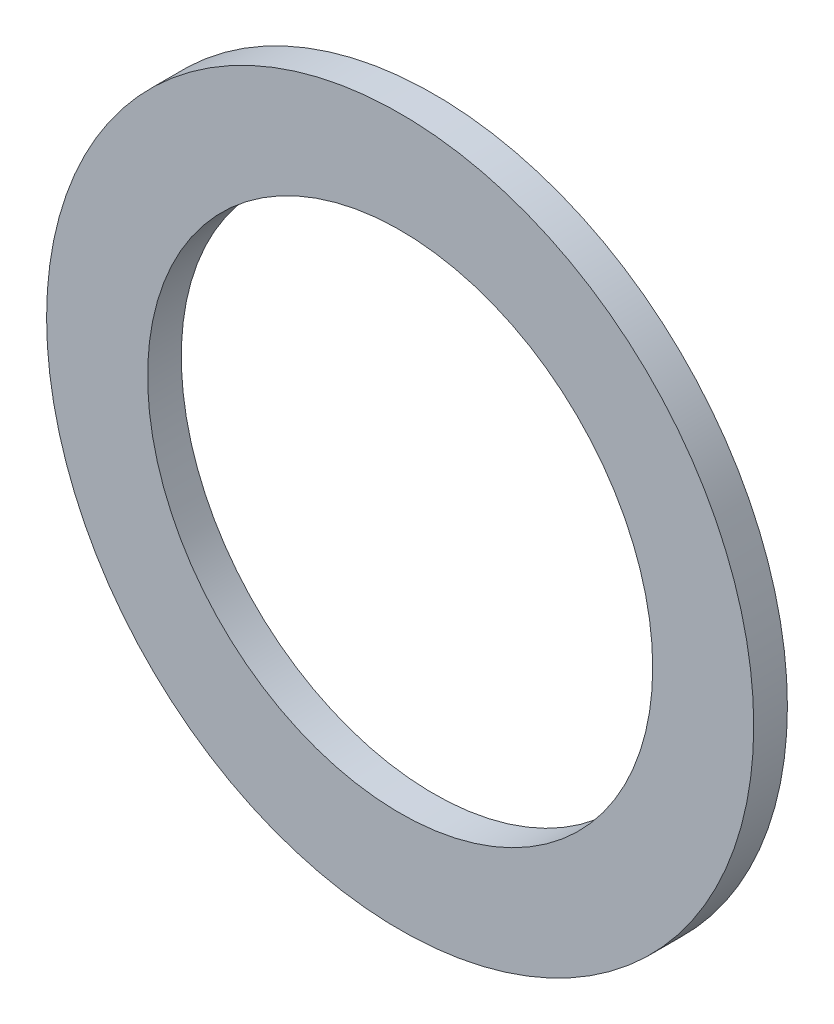
ISO-10303-21;
HEADER;
FILE_DESCRIPTION(('STEP AP214'),'2;1');
FILE_NAME('part.step','',(''),(''),'','','');
FILE_SCHEMA(('AUTOMOTIVE_DESIGN { 1 0 10303 214 1 1 1 1 }'));
ENDSEC;
DATA;
#1=APPLICATION_CONTEXT('core data for automotive mechanical design processes');
#2=APPLICATION_PROTOCOL_DEFINITION('international standard','automotive_design',2000,#1);
#3=PRODUCT_CONTEXT('',#1,'mechanical');
#4=PRODUCT('Part','Part','',(#3));
#5=PRODUCT_RELATED_PRODUCT_CATEGORY('part','',(#4));
#6=PRODUCT_DEFINITION_FORMATION('','',#4);
#7=PRODUCT_DEFINITION_CONTEXT('part definition',#1,'design');
#8=PRODUCT_DEFINITION('design','',#6,#7);
#9=PRODUCT_DEFINITION_SHAPE('','',#8);
#10=(LENGTH_UNIT() NAMED_UNIT(*) SI_UNIT(.MILLI.,.METRE.));
#11=(NAMED_UNIT(*) PLANE_ANGLE_UNIT() SI_UNIT($,.RADIAN.));
#12=(NAMED_UNIT(*) SI_UNIT($,.STERADIAN.) SOLID_ANGLE_UNIT());
#13=UNCERTAINTY_MEASURE_WITH_UNIT(LENGTH_MEASURE(1.E-05),#10,'distance_accuracy_value','');
#14=(GEOMETRIC_REPRESENTATION_CONTEXT(3) GLOBAL_UNCERTAINTY_ASSIGNED_CONTEXT((#13)) GLOBAL_UNIT_ASSIGNED_CONTEXT((#10,
#11,#12)) REPRESENTATION_CONTEXT('',''));
#15=CARTESIAN_POINT('',(0.,0.,0.));
#16=DIRECTION('',(0.,0.,1.));
#17=DIRECTION('',(1.,0.,0.));
#18=AXIS2_PLACEMENT_3D('',#15,#16,#17);
#19=CARTESIAN_POINT('',(0.,0.,1.));
#20=DIRECTION('',(0.,0.,1.));
#21=DIRECTION('',(1.,0.,0.));
#22=AXIS2_PLACEMENT_3D('',#19,#20,#21);
#23=PLANE('',#22);
#24=CARTESIAN_POINT('',(0.,0.,1.));
#25=DIRECTION('',(0.,0.,1.));
#26=DIRECTION('',(1.,0.,0.));
#27=AXIS2_PLACEMENT_3D('',#24,#25,#26);
#28=CIRCLE('',#27,10.5);
#29=CARTESIAN_POINT('',(10.5,0.,1.));
#30=VERTEX_POINT('',#29);
#31=EDGE_CURVE('E10',#30,#30,#28,.T.);
#32=ORIENTED_EDGE('',*,*,#31,.T.);
#33=EDGE_LOOP('',(#32));
#34=FACE_BOUND('',#33,.T.);
#35=CARTESIAN_POINT('',(0.,0.,1.));
#36=DIRECTION('',(0.,0.,1.));
#37=DIRECTION('',(1.,0.,0.));
#38=AXIS2_PLACEMENT_3D('',#35,#36,#37);
#39=CIRCLE('',#38,7.5);
#40=CARTESIAN_POINT('',(7.5,0.,1.));
#41=VERTEX_POINT('',#40);
#42=EDGE_CURVE('E49',#41,#41,#39,.T.);
#43=ORIENTED_EDGE('',*,*,#42,.F.);
#44=EDGE_LOOP('',(#43));
#45=FACE_BOUND('',#44,.T.);
#46=ADVANCED_FACE('F38',(#34,#45),#23,.T.);
#47=CARTESIAN_POINT('',(0.,0.,0.));
#48=DIRECTION('',(0.,0.,1.));
#49=DIRECTION('',(1.,0.,0.));
#50=AXIS2_PLACEMENT_3D('',#47,#48,#49);
#51=PLANE('',#50);
#52=CARTESIAN_POINT('',(0.,0.,0.));
#53=DIRECTION('',(0.,0.,1.));
#54=DIRECTION('',(1.,0.,0.));
#55=AXIS2_PLACEMENT_3D('',#52,#53,#54);
#56=CIRCLE('',#55,10.5);
#57=CARTESIAN_POINT('',(10.5,0.,0.));
#58=VERTEX_POINT('',#57);
#59=EDGE_CURVE('E42',#58,#58,#56,.T.);
#60=ORIENTED_EDGE('',*,*,#59,.F.);
#61=EDGE_LOOP('',(#60));
#62=FACE_BOUND('',#61,.T.);
#63=CARTESIAN_POINT('',(0.,0.,0.));
#64=DIRECTION('',(0.,0.,1.));
#65=DIRECTION('',(1.,0.,0.));
#66=AXIS2_PLACEMENT_3D('',#63,#64,#65);
#67=CIRCLE('',#66,7.5);
#68=CARTESIAN_POINT('',(7.5,0.,0.));
#69=VERTEX_POINT('',#68);
#70=EDGE_CURVE('E51',#69,#69,#67,.T.);
#71=ORIENTED_EDGE('',*,*,#70,.T.);
#72=EDGE_LOOP('',(#71));
#73=FACE_BOUND('',#72,.T.);
#74=ADVANCED_FACE('F61',(#62,#73),#51,.F.);
#75=CARTESIAN_POINT('',(0.,0.,1.));
#76=DIRECTION('',(0.,0.,-1.));
#77=DIRECTION('',(-1.,0.,0.));
#78=AXIS2_PLACEMENT_3D('',#75,#76,#77);
#79=CYLINDRICAL_SURFACE('',#78,10.5);
#80=ORIENTED_EDGE('',*,*,#31,.F.);
#81=EDGE_LOOP('',(#80));
#82=FACE_BOUND('',#81,.T.);
#83=ORIENTED_EDGE('',*,*,#59,.T.);
#84=EDGE_LOOP('',(#83));
#85=FACE_BOUND('',#84,.T.);
#86=ADVANCED_FACE('F40',(#82,#85),#79,.T.);
#87=CARTESIAN_POINT('',(0.,0.,1.));
#88=DIRECTION('',(0.,0.,-1.));
#89=DIRECTION('',(-1.,0.,0.));
#90=AXIS2_PLACEMENT_3D('',#87,#88,#89);
#91=CYLINDRICAL_SURFACE('',#90,7.5);
#92=ORIENTED_EDGE('',*,*,#42,.T.);
#93=EDGE_LOOP('',(#92));
#94=FACE_BOUND('',#93,.T.);
#95=ORIENTED_EDGE('',*,*,#70,.F.);
#96=EDGE_LOOP('',(#95));
#97=FACE_BOUND('',#96,.T.);
#98=ADVANCED_FACE('F57',(#94,#97),#91,.F.);
#99=CLOSED_SHELL('',(#46,#74,#86,#98));
#100=MANIFOLD_SOLID_BREP('B2',#99);
#101=ADVANCED_BREP_SHAPE_REPRESENTATION('',(#18,#100),#14);
#102=SHAPE_DEFINITION_REPRESENTATION(#9,#101);
ENDSEC;
END-ISO-10303-21;
